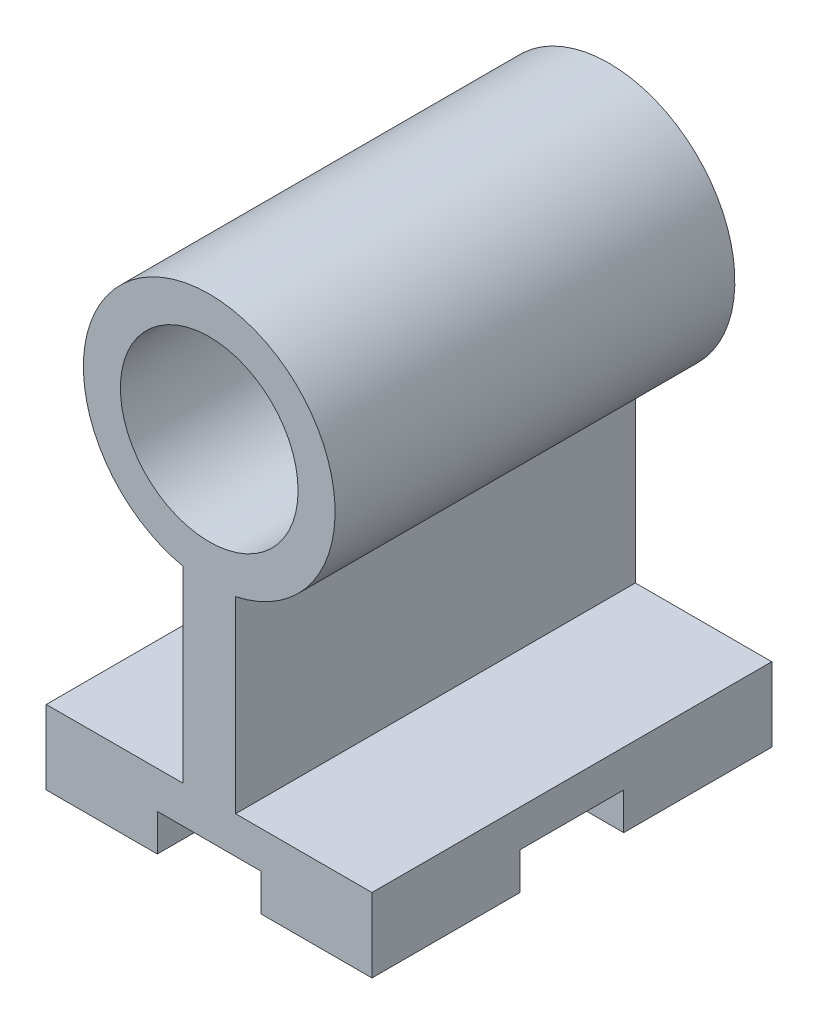
ISO-10303-21;
HEADER;
FILE_DESCRIPTION(('STEP AP214'),'2;1');
FILE_NAME('part.step','',(''),(''),'','','');
FILE_SCHEMA(('AUTOMOTIVE_DESIGN { 1 0 10303 214 1 1 1 1 }'));
ENDSEC;
DATA;
#1=APPLICATION_CONTEXT('core data for automotive mechanical design processes');
#2=APPLICATION_PROTOCOL_DEFINITION('international standard','automotive_design',2000,#1);
#3=PRODUCT_CONTEXT('',#1,'mechanical');
#4=PRODUCT('Part','Part','',(#3));
#5=PRODUCT_RELATED_PRODUCT_CATEGORY('part','',(#4));
#6=PRODUCT_DEFINITION_FORMATION('','',#4);
#7=PRODUCT_DEFINITION_CONTEXT('part definition',#1,'design');
#8=PRODUCT_DEFINITION('design','',#6,#7);
#9=PRODUCT_DEFINITION_SHAPE('','',#8);
#10=(LENGTH_UNIT() NAMED_UNIT(*) SI_UNIT(.MILLI.,.METRE.));
#11=(NAMED_UNIT(*) PLANE_ANGLE_UNIT() SI_UNIT($,.RADIAN.));
#12=(NAMED_UNIT(*) SI_UNIT($,.STERADIAN.) SOLID_ANGLE_UNIT());
#13=UNCERTAINTY_MEASURE_WITH_UNIT(LENGTH_MEASURE(1.E-05),#10,'distance_accuracy_value','');
#14=(GEOMETRIC_REPRESENTATION_CONTEXT(3) GLOBAL_UNCERTAINTY_ASSIGNED_CONTEXT((#13)) GLOBAL_UNIT_ASSIGNED_CONTEXT((#10,
#11,#12)) REPRESENTATION_CONTEXT('',''));
#15=CARTESIAN_POINT('',(0.,0.,0.));
#16=DIRECTION('',(0.,0.,1.));
#17=DIRECTION('',(1.,0.,0.));
#18=AXIS2_PLACEMENT_3D('',#15,#16,#17);
#19=CARTESIAN_POINT('',(7.,0.,-54.));
#20=DIRECTION('',(0.,-1.,0.));
#21=DIRECTION('',(1.,0.,0.));
#22=AXIS2_PLACEMENT_3D('',#19,#20,#21);
#23=PLANE('',#22);
#24=DIRECTION('',(1.,0.,0.));
#25=VECTOR('',#24,1.);
#26=CARTESIAN_POINT('',(-22.,0.,-20.));
#27=LINE('',#26,#25);
#28=CARTESIAN_POINT('',(7.,0.,-20.));
#29=VERTEX_POINT('',#28);
#30=CARTESIAN_POINT('',(22.,0.,-20.));
#31=VERTEX_POINT('',#30);
#32=EDGE_CURVE('E183',#29,#31,#27,.T.);
#33=ORIENTED_EDGE('',*,*,#32,.T.);
#34=DIRECTION('',(0.,0.,1.));
#35=VECTOR('',#34,1.);
#36=CARTESIAN_POINT('',(22.,0.,-54.));
#37=LINE('',#36,#35);
#38=CARTESIAN_POINT('',(22.,0.,0.));
#39=VERTEX_POINT('',#38);
#40=EDGE_CURVE('E221',#31,#39,#37,.T.);
#41=ORIENTED_EDGE('',*,*,#40,.T.);
#42=DIRECTION('',(1.,0.,0.));
#43=VECTOR('',#42,1.);
#44=CARTESIAN_POINT('',(7.,0.,0.));
#45=LINE('',#44,#43);
#46=CARTESIAN_POINT('',(7.,0.,0.));
#47=VERTEX_POINT('',#46);
#48=EDGE_CURVE('E239',#47,#39,#45,.T.);
#49=ORIENTED_EDGE('',*,*,#48,.F.);
#50=DIRECTION('',(0.,0.,1.));
#51=VECTOR('',#50,1.);
#52=CARTESIAN_POINT('',(7.,0.,-54.));
#53=LINE('',#52,#51);
#54=EDGE_CURVE('E42',#29,#47,#53,.T.);
#55=ORIENTED_EDGE('',*,*,#54,.F.);
#56=EDGE_LOOP('',(#33,#41,#49,#55));
#57=FACE_BOUND('',#56,.T.);
#58=ADVANCED_FACE('F33',(#57),#23,.T.);
#59=CARTESIAN_POINT('',(7.,0.,-54.));
#60=DIRECTION('',(-1.,0.,0.));
#61=DIRECTION('',(0.,0.,1.));
#62=AXIS2_PLACEMENT_3D('',#59,#60,#61);
#63=PLANE('',#62);
#64=DIRECTION('',(0.,1.,0.));
#65=VECTOR('',#64,1.);
#66=CARTESIAN_POINT('',(7.,0.,-20.));
#67=LINE('',#66,#65);
#68=CARTESIAN_POINT('',(7.,5.,-20.));
#69=VERTEX_POINT('',#68);
#70=EDGE_CURVE('E344',#29,#69,#67,.T.);
#71=ORIENTED_EDGE('',*,*,#70,.F.);
#72=ORIENTED_EDGE('',*,*,#54,.T.);
#73=DIRECTION('',(0.,-1.,0.));
#74=VECTOR('',#73,1.);
#75=CARTESIAN_POINT('',(7.,0.,0.));
#76=LINE('',#75,#74);
#77=CARTESIAN_POINT('',(7.,5.,0.));
#78=VERTEX_POINT('',#77);
#79=EDGE_CURVE('E270',#78,#47,#76,.T.);
#80=ORIENTED_EDGE('',*,*,#79,.F.);
#81=DIRECTION('',(0.,0.,1.));
#82=VECTOR('',#81,1.);
#83=CARTESIAN_POINT('',(7.,5.,-54.));
#84=LINE('',#83,#82);
#85=EDGE_CURVE('E276',#69,#78,#84,.T.);
#86=ORIENTED_EDGE('',*,*,#85,.F.);
#87=EDGE_LOOP('',(#71,#72,#80,#86));
#88=FACE_BOUND('',#87,.T.);
#89=ADVANCED_FACE('F386',(#88),#63,.T.);
#90=CARTESIAN_POINT('',(-7.,0.,-54.));
#91=DIRECTION('',(1.,0.,0.));
#92=DIRECTION('',(0.,0.,-1.));
#93=AXIS2_PLACEMENT_3D('',#90,#91,#92);
#94=PLANE('',#93);
#95=DIRECTION('',(0.,-1.,0.));
#96=VECTOR('',#95,1.);
#97=CARTESIAN_POINT('',(-7.,0.,-20.));
#98=LINE('',#97,#96);
#99=CARTESIAN_POINT('',(-7.,5.,-20.));
#100=VERTEX_POINT('',#99);
#101=CARTESIAN_POINT('',(-7.,0.,-20.));
#102=VERTEX_POINT('',#101);
#103=EDGE_CURVE('E179',#100,#102,#98,.T.);
#104=ORIENTED_EDGE('',*,*,#103,.F.);
#105=DIRECTION('',(0.,0.,1.));
#106=VECTOR('',#105,1.);
#107=CARTESIAN_POINT('',(-7.,5.,-54.));
#108=LINE('',#107,#106);
#109=CARTESIAN_POINT('',(-7.,5.,0.));
#110=VERTEX_POINT('',#109);
#111=EDGE_CURVE('E279',#100,#110,#108,.T.);
#112=ORIENTED_EDGE('',*,*,#111,.T.);
#113=DIRECTION('',(0.,1.,0.));
#114=VECTOR('',#113,1.);
#115=CARTESIAN_POINT('',(-7.,0.,0.));
#116=LINE('',#115,#114);
#117=CARTESIAN_POINT('',(-7.,0.,0.));
#118=VERTEX_POINT('',#117);
#119=EDGE_CURVE('E264',#118,#110,#116,.T.);
#120=ORIENTED_EDGE('',*,*,#119,.F.);
#121=DIRECTION('',(0.,0.,1.));
#122=VECTOR('',#121,1.);
#123=CARTESIAN_POINT('',(-7.,0.,-54.));
#124=LINE('',#123,#122);
#125=EDGE_CURVE('E202',#102,#118,#124,.T.);
#126=ORIENTED_EDGE('',*,*,#125,.F.);
#127=EDGE_LOOP('',(#104,#112,#120,#126));
#128=FACE_BOUND('',#127,.T.);
#129=ADVANCED_FACE('F291',(#128),#94,.T.);
#130=CARTESIAN_POINT('',(-22.,0.,-54.));
#131=DIRECTION('',(0.,-1.,0.));
#132=DIRECTION('',(0.,0.,-1.));
#133=AXIS2_PLACEMENT_3D('',#130,#131,#132);
#134=PLANE('',#133);
#135=CARTESIAN_POINT('',(-22.,0.,-20.));
#136=VERTEX_POINT('',#135);
#137=EDGE_CURVE('E174',#136,#102,#27,.T.);
#138=ORIENTED_EDGE('',*,*,#137,.T.);
#139=ORIENTED_EDGE('',*,*,#125,.T.);
#140=DIRECTION('',(1.,0.,0.));
#141=VECTOR('',#140,1.);
#142=CARTESIAN_POINT('',(-22.,0.,0.));
#143=LINE('',#142,#141);
#144=CARTESIAN_POINT('',(-22.,0.,0.));
#145=VERTEX_POINT('',#144);
#146=EDGE_CURVE('E196',#145,#118,#143,.T.);
#147=ORIENTED_EDGE('',*,*,#146,.F.);
#148=DIRECTION('',(0.,0.,1.));
#149=VECTOR('',#148,1.);
#150=CARTESIAN_POINT('',(-22.,0.,-54.));
#151=LINE('',#150,#149);
#152=EDGE_CURVE('E188',#136,#145,#151,.T.);
#153=ORIENTED_EDGE('',*,*,#152,.F.);
#154=EDGE_LOOP('',(#138,#139,#147,#153));
#155=FACE_BOUND('',#154,.T.);
#156=ADVANCED_FACE('F194',(#155),#134,.T.);
#157=DIRECTION('',(1.,0.,0.));
#158=VECTOR('',#157,1.);
#159=CARTESIAN_POINT('',(-22.,0.,-34.));
#160=LINE('',#159,#158);
#161=CARTESIAN_POINT('',(7.,0.,-34.));
#162=VERTEX_POINT('',#161);
#163=CARTESIAN_POINT('',(22.,0.,-34.));
#164=VERTEX_POINT('',#163);
#165=EDGE_CURVE('E58',#162,#164,#160,.T.);
#166=ORIENTED_EDGE('',*,*,#165,.F.);
#167=CARTESIAN_POINT('',(7.,0.,-54.));
#168=VERTEX_POINT('',#167);
#169=EDGE_CURVE('E11',#168,#162,#53,.T.);
#170=ORIENTED_EDGE('',*,*,#169,.F.);
#171=DIRECTION('',(1.,0.,0.));
#172=VECTOR('',#171,1.);
#173=CARTESIAN_POINT('',(7.,0.,-54.));
#174=LINE('',#173,#172);
#175=CARTESIAN_POINT('',(22.,0.,-54.));
#176=VERTEX_POINT('',#175);
#177=EDGE_CURVE('E272',#168,#176,#174,.T.);
#178=ORIENTED_EDGE('',*,*,#177,.T.);
#179=EDGE_CURVE('E37',#176,#164,#37,.T.);
#180=ORIENTED_EDGE('',*,*,#179,.T.);
#181=EDGE_LOOP('',(#166,#170,#178,#180));
#182=FACE_BOUND('',#181,.T.);
#183=ADVANCED_FACE('F35',(#182),#23,.T.);
#184=DIRECTION('',(0.,-1.,0.));
#185=VECTOR('',#184,1.);
#186=CARTESIAN_POINT('',(7.,0.,-34.));
#187=LINE('',#186,#185);
#188=CARTESIAN_POINT('',(7.,5.,-34.));
#189=VERTEX_POINT('',#188);
#190=EDGE_CURVE('E341',#189,#162,#187,.T.);
#191=ORIENTED_EDGE('',*,*,#190,.F.);
#192=CARTESIAN_POINT('',(7.,5.,-54.));
#193=VERTEX_POINT('',#192);
#194=EDGE_CURVE('E274',#193,#189,#84,.T.);
#195=ORIENTED_EDGE('',*,*,#194,.F.);
#196=DIRECTION('',(0.,-1.,0.));
#197=VECTOR('',#196,1.);
#198=CARTESIAN_POINT('',(7.,0.,-54.));
#199=LINE('',#198,#197);
#200=EDGE_CURVE('E224',#193,#168,#199,.T.);
#201=ORIENTED_EDGE('',*,*,#200,.T.);
#202=ORIENTED_EDGE('',*,*,#169,.T.);
#203=EDGE_LOOP('',(#191,#195,#201,#202));
#204=FACE_BOUND('',#203,.T.);
#205=ADVANCED_FACE('F378',(#204),#63,.T.);
#206=CARTESIAN_POINT('',(-7.,5.,-54.));
#207=DIRECTION('',(0.,-1.,0.));
#208=DIRECTION('',(1.,0.,0.));
#209=AXIS2_PLACEMENT_3D('',#206,#207,#208);
#210=PLANE('',#209);
#211=ORIENTED_EDGE('',*,*,#194,.T.);
#212=DIRECTION('',(1.,0.,0.));
#213=VECTOR('',#212,1.);
#214=CARTESIAN_POINT('',(-22.,5.,-34.));
#215=LINE('',#214,#213);
#216=CARTESIAN_POINT('',(22.,5.,-34.));
#217=VERTEX_POINT('',#216);
#218=EDGE_CURVE('E338',#189,#217,#215,.T.);
#219=ORIENTED_EDGE('',*,*,#218,.T.);
#220=DIRECTION('',(0.,0.,1.));
#221=VECTOR('',#220,1.);
#222=CARTESIAN_POINT('',(22.,5.,-20.));
#223=LINE('',#222,#221);
#224=CARTESIAN_POINT('',(22.,5.,-20.));
#225=VERTEX_POINT('',#224);
#226=EDGE_CURVE('E192',#217,#225,#223,.T.);
#227=ORIENTED_EDGE('',*,*,#226,.T.);
#228=DIRECTION('',(1.,0.,0.));
#229=VECTOR('',#228,1.);
#230=CARTESIAN_POINT('',(-22.,5.,-20.));
#231=LINE('',#230,#229);
#232=EDGE_CURVE('E335',#69,#225,#231,.T.);
#233=ORIENTED_EDGE('',*,*,#232,.F.);
#234=ORIENTED_EDGE('',*,*,#85,.T.);
#235=DIRECTION('',(1.,0.,0.));
#236=VECTOR('',#235,1.);
#237=CARTESIAN_POINT('',(-7.,5.,0.));
#238=LINE('',#237,#236);
#239=EDGE_CURVE('E267',#110,#78,#238,.T.);
#240=ORIENTED_EDGE('',*,*,#239,.F.);
#241=ORIENTED_EDGE('',*,*,#111,.F.);
#242=CARTESIAN_POINT('',(-22.,5.,-20.));
#243=VERTEX_POINT('',#242);
#244=EDGE_CURVE('E332',#243,#100,#231,.T.);
#245=ORIENTED_EDGE('',*,*,#244,.F.);
#246=DIRECTION('',(0.,0.,1.));
#247=VECTOR('',#246,1.);
#248=CARTESIAN_POINT('',(-22.,5.,-20.));
#249=LINE('',#248,#247);
#250=CARTESIAN_POINT('',(-22.,5.,-34.));
#251=VERTEX_POINT('',#250);
#252=EDGE_CURVE('E50',#251,#243,#249,.T.);
#253=ORIENTED_EDGE('',*,*,#252,.F.);
#254=CARTESIAN_POINT('',(-7.,5.,-34.));
#255=VERTEX_POINT('',#254);
#256=EDGE_CURVE('E336',#251,#255,#215,.T.);
#257=ORIENTED_EDGE('',*,*,#256,.T.);
#258=CARTESIAN_POINT('',(-7.,5.,-54.));
#259=VERTEX_POINT('',#258);
#260=EDGE_CURVE('E277',#259,#255,#108,.T.);
#261=ORIENTED_EDGE('',*,*,#260,.F.);
#262=DIRECTION('',(1.,0.,0.));
#263=VECTOR('',#262,1.);
#264=CARTESIAN_POINT('',(-7.,5.,-54.));
#265=LINE('',#264,#263);
#266=EDGE_CURVE('E230',#259,#193,#265,.T.);
#267=ORIENTED_EDGE('',*,*,#266,.T.);
#268=EDGE_LOOP('',(#211,#219,#227,#233,#234,#240,#241,#245,#253,#257,#261,#267));
#269=FACE_BOUND('',#268,.T.);
#270=ADVANCED_FACE('F379',(#269),#210,.T.);
#271=DIRECTION('',(0.,1.,0.));
#272=VECTOR('',#271,1.);
#273=CARTESIAN_POINT('',(-7.,0.,-34.));
#274=LINE('',#273,#272);
#275=CARTESIAN_POINT('',(-7.,0.,-34.));
#276=VERTEX_POINT('',#275);
#277=EDGE_CURVE('E334',#276,#255,#274,.T.);
#278=ORIENTED_EDGE('',*,*,#277,.F.);
#279=CARTESIAN_POINT('',(-7.,0.,-54.));
#280=VERTEX_POINT('',#279);
#281=EDGE_CURVE('E206',#280,#276,#124,.T.);
#282=ORIENTED_EDGE('',*,*,#281,.F.);
#283=DIRECTION('',(0.,1.,0.));
#284=VECTOR('',#283,1.);
#285=CARTESIAN_POINT('',(-7.,0.,-54.));
#286=LINE('',#285,#284);
#287=EDGE_CURVE('E235',#280,#259,#286,.T.);
#288=ORIENTED_EDGE('',*,*,#287,.T.);
#289=ORIENTED_EDGE('',*,*,#260,.T.);
#290=EDGE_LOOP('',(#278,#282,#288,#289));
#291=FACE_BOUND('',#290,.T.);
#292=ADVANCED_FACE('F318',(#291),#94,.T.);
#293=CARTESIAN_POINT('',(-22.,0.,-34.));
#294=VERTEX_POINT('',#293);
#295=EDGE_CURVE('E321',#294,#276,#160,.T.);
#296=ORIENTED_EDGE('',*,*,#295,.F.);
#297=CARTESIAN_POINT('',(-22.,0.,-54.));
#298=VERTEX_POINT('',#297);
#299=EDGE_CURVE('E198',#298,#294,#151,.T.);
#300=ORIENTED_EDGE('',*,*,#299,.F.);
#301=DIRECTION('',(1.,0.,0.));
#302=VECTOR('',#301,1.);
#303=CARTESIAN_POINT('',(-22.,0.,-54.));
#304=LINE('',#303,#302);
#305=EDGE_CURVE('E309',#298,#280,#304,.T.);
#306=ORIENTED_EDGE('',*,*,#305,.T.);
#307=ORIENTED_EDGE('',*,*,#281,.T.);
#308=EDGE_LOOP('',(#296,#300,#306,#307));
#309=FACE_BOUND('',#308,.T.);
#310=ADVANCED_FACE('F320',(#309),#134,.T.);
#311=CARTESIAN_POINT('',(-22.,0.,-54.));
#312=DIRECTION('',(-1.,0.,0.));
#313=DIRECTION('',(0.,-1.,0.));
#314=AXIS2_PLACEMENT_3D('',#311,#312,#313);
#315=PLANE('',#314);
#316=DIRECTION('',(0.,-1.,0.));
#317=VECTOR('',#316,1.);
#318=CARTESIAN_POINT('',(-22.,0.,-20.));
#319=LINE('',#318,#317);
#320=EDGE_CURVE('E177',#243,#136,#319,.T.);
#321=ORIENTED_EDGE('',*,*,#320,.T.);
#322=ORIENTED_EDGE('',*,*,#152,.T.);
#323=DIRECTION('',(0.,-1.,0.));
#324=VECTOR('',#323,1.);
#325=CARTESIAN_POINT('',(-22.,0.,0.));
#326=LINE('',#325,#324);
#327=CARTESIAN_POINT('',(-22.,10.,0.));
#328=VERTEX_POINT('',#327);
#329=EDGE_CURVE('E261',#328,#145,#326,.T.);
#330=ORIENTED_EDGE('',*,*,#329,.F.);
#331=DIRECTION('',(0.,0.,1.));
#332=VECTOR('',#331,1.);
#333=CARTESIAN_POINT('',(-22.,10.,-54.));
#334=LINE('',#333,#332);
#335=CARTESIAN_POINT('',(-22.,10.,-54.));
#336=VERTEX_POINT('',#335);
#337=EDGE_CURVE('E199',#336,#328,#334,.T.);
#338=ORIENTED_EDGE('',*,*,#337,.F.);
#339=DIRECTION('',(0.,-1.,0.));
#340=VECTOR('',#339,1.);
#341=CARTESIAN_POINT('',(-22.,0.,-54.));
#342=LINE('',#341,#340);
#343=EDGE_CURVE('E297',#336,#298,#342,.T.);
#344=ORIENTED_EDGE('',*,*,#343,.T.);
#345=ORIENTED_EDGE('',*,*,#299,.T.);
#346=DIRECTION('',(0.,1.,0.));
#347=VECTOR('',#346,1.);
#348=CARTESIAN_POINT('',(-22.,0.,-34.));
#349=LINE('',#348,#347);
#350=EDGE_CURVE('E191',#294,#251,#349,.T.);
#351=ORIENTED_EDGE('',*,*,#350,.T.);
#352=ORIENTED_EDGE('',*,*,#252,.T.);
#353=EDGE_LOOP('',(#321,#322,#330,#338,#344,#345,#351,#352));
#354=FACE_BOUND('',#353,.T.);
#355=ADVANCED_FACE('F186',(#354),#315,.T.);
#356=CARTESIAN_POINT('',(-22.,10.,-54.));
#357=DIRECTION('',(-0.00128591107310643,0.999999173216014,0.));
#358=DIRECTION('',(-0.999999173216014,-0.00128591107310643,0.));
#359=AXIS2_PLACEMENT_3D('',#356,#357,#358);
#360=PLANE('',#359);
#361=DIRECTION('',(-0.999999173216014,-0.00128591107310643,0.));
#362=VECTOR('',#361,1.);
#363=CARTESIAN_POINT('',(-22.,10.,0.));
#364=LINE('',#363,#362);
#365=CARTESIAN_POINT('',(-3.54293612880951,10.023734162432,0.));
#366=VERTEX_POINT('',#365);
#367=EDGE_CURVE('E258',#366,#328,#364,.T.);
#368=ORIENTED_EDGE('',*,*,#367,.F.);
#369=DIRECTION('',(0.,0.,1.));
#370=VECTOR('',#369,1.);
#371=CARTESIAN_POINT('',(-3.54293612880951,10.023734162432,-54.));
#372=LINE('',#371,#370);
#373=CARTESIAN_POINT('',(-3.54293612880951,10.023734162432,-54.));
#374=VERTEX_POINT('',#373);
#375=EDGE_CURVE('E203',#374,#366,#372,.T.);
#376=ORIENTED_EDGE('',*,*,#375,.F.);
#377=DIRECTION('',(-0.999999173216014,-0.00128591107310643,0.));
#378=VECTOR('',#377,1.);
#379=CARTESIAN_POINT('',(-22.,10.,-54.));
#380=LINE('',#379,#378);
#381=EDGE_CURVE('E306',#374,#336,#380,.T.);
#382=ORIENTED_EDGE('',*,*,#381,.T.);
#383=ORIENTED_EDGE('',*,*,#337,.T.);
#384=EDGE_LOOP('',(#368,#376,#382,#383));
#385=FACE_BOUND('',#384,.T.);
#386=ADVANCED_FACE('F311',(#385),#360,.T.);
#387=CARTESIAN_POINT('',(-3.54293612880951,35.4051633381654,-54.));
#388=DIRECTION('',(-1.,0.,0.));
#389=DIRECTION('',(0.,0.,1.));
#390=AXIS2_PLACEMENT_3D('',#387,#388,#389);
#391=PLANE('',#390);
#392=DIRECTION('',(0.,-1.,0.));
#393=VECTOR('',#392,1.);
#394=CARTESIAN_POINT('',(-3.54293612880951,35.4051633381654,0.));
#395=LINE('',#394,#393);
#396=CARTESIAN_POINT('',(-3.54293612880952,35.4051633381654,0.));
#397=VERTEX_POINT('',#396);
#398=EDGE_CURVE('E255',#397,#366,#395,.T.);
#399=ORIENTED_EDGE('',*,*,#398,.F.);
#400=DIRECTION('',(0.,0.,1.));
#401=VECTOR('',#400,1.);
#402=CARTESIAN_POINT('',(-3.54293612880952,35.4051633381654,-54.));
#403=LINE('',#402,#401);
#404=CARTESIAN_POINT('',(-3.54293612880952,35.4051633381654,-54.));
#405=VERTEX_POINT('',#404);
#406=EDGE_CURVE('E210',#405,#397,#403,.T.);
#407=ORIENTED_EDGE('',*,*,#406,.F.);
#408=DIRECTION('',(0.,-1.,0.));
#409=VECTOR('',#408,1.);
#410=CARTESIAN_POINT('',(-3.54293612880951,35.4051633381654,-54.));
#411=LINE('',#410,#409);
#412=EDGE_CURVE('E312',#405,#374,#411,.T.);
#413=ORIENTED_EDGE('',*,*,#412,.T.);
#414=ORIENTED_EDGE('',*,*,#375,.T.);
#415=EDGE_LOOP('',(#399,#407,#413,#414));
#416=FACE_BOUND('',#415,.T.);
#417=ADVANCED_FACE('F428',(#416),#391,.T.);
#418=CARTESIAN_POINT('',(0.0165296468139821,52.0283460476277,-54.));
#419=DIRECTION('',(0.,0.,1.));
#420=DIRECTION('',(1.,0.,0.));
#421=AXIS2_PLACEMENT_3D('',#418,#419,#420);
#422=CYLINDRICAL_SURFACE('',#421,17.);
#423=CARTESIAN_POINT('',(0.0165296468139821,52.0283460476277,0.));
#424=DIRECTION('',(0.,0.,1.));
#425=DIRECTION('',(1.,0.,0.));
#426=AXIS2_PLACEMENT_3D('',#423,#424,#425);
#427=CIRCLE('',#426,17.);
#428=CARTESIAN_POINT('',(3.57599542243748,35.4051633381654,0.));
#429=VERTEX_POINT('',#428);
#430=EDGE_CURVE('E252',#429,#397,#427,.T.);
#431=ORIENTED_EDGE('',*,*,#430,.F.);
#432=DIRECTION('',(0.,0.,1.));
#433=VECTOR('',#432,1.);
#434=CARTESIAN_POINT('',(3.57599542243748,35.4051633381654,-54.));
#435=LINE('',#434,#433);
#436=CARTESIAN_POINT('',(3.57599542243748,35.4051633381654,-54.));
#437=VERTEX_POINT('',#436);
#438=EDGE_CURVE('E212',#437,#429,#435,.T.);
#439=ORIENTED_EDGE('',*,*,#438,.F.);
#440=CARTESIAN_POINT('',(0.0165296468139821,52.0283460476277,-54.));
#441=DIRECTION('',(0.,0.,1.));
#442=DIRECTION('',(1.,0.,0.));
#443=AXIS2_PLACEMENT_3D('',#440,#441,#442);
#444=CIRCLE('',#443,17.);
#445=EDGE_CURVE('E314',#437,#405,#444,.T.);
#446=ORIENTED_EDGE('',*,*,#445,.T.);
#447=ORIENTED_EDGE('',*,*,#406,.T.);
#448=EDGE_LOOP('',(#431,#439,#446,#447));
#449=FACE_BOUND('',#448,.T.);
#450=ADVANCED_FACE('F363',(#449),#422,.T.);
#451=CARTESIAN_POINT('',(3.57599542243748,35.4051633381654,-54.));
#452=DIRECTION('',(1.,0.,0.));
#453=DIRECTION('',(0.,1.,0.));
#454=AXIS2_PLACEMENT_3D('',#451,#452,#453);
#455=PLANE('',#454);
#456=DIRECTION('',(0.,1.,0.));
#457=VECTOR('',#456,1.);
#458=CARTESIAN_POINT('',(3.57599542243748,35.4051633381654,0.));
#459=LINE('',#458,#457);
#460=CARTESIAN_POINT('',(3.57599542243748,9.99999999999999,0.));
#461=VERTEX_POINT('',#460);
#462=EDGE_CURVE('E249',#461,#429,#459,.T.);
#463=ORIENTED_EDGE('',*,*,#462,.F.);
#464=DIRECTION('',(0.,0.,1.));
#465=VECTOR('',#464,1.);
#466=CARTESIAN_POINT('',(3.57599542243748,9.99999999999999,-54.));
#467=LINE('',#466,#465);
#468=CARTESIAN_POINT('',(3.57599542243748,9.99999999999999,-54.));
#469=VERTEX_POINT('',#468);
#470=EDGE_CURVE('E214',#469,#461,#467,.T.);
#471=ORIENTED_EDGE('',*,*,#470,.F.);
#472=DIRECTION('',(0.,1.,0.));
#473=VECTOR('',#472,1.);
#474=CARTESIAN_POINT('',(3.57599542243748,35.4051633381654,-54.));
#475=LINE('',#474,#473);
#476=EDGE_CURVE('E357',#469,#437,#475,.T.);
#477=ORIENTED_EDGE('',*,*,#476,.T.);
#478=ORIENTED_EDGE('',*,*,#438,.T.);
#479=EDGE_LOOP('',(#463,#471,#477,#478));
#480=FACE_BOUND('',#479,.T.);
#481=ADVANCED_FACE('F369',(#480),#455,.T.);
#482=CARTESIAN_POINT('',(3.57599542243748,9.99999999999999,-54.));
#483=DIRECTION('',(0.,1.,0.));
#484=DIRECTION('',(-1.,0.,0.));
#485=AXIS2_PLACEMENT_3D('',#482,#483,#484);
#486=PLANE('',#485);
#487=DIRECTION('',(-1.,0.,0.));
#488=VECTOR('',#487,1.);
#489=CARTESIAN_POINT('',(3.57599542243748,9.99999999999999,0.));
#490=LINE('',#489,#488);
#491=CARTESIAN_POINT('',(22.,10.,0.));
#492=VERTEX_POINT('',#491);
#493=EDGE_CURVE('E246',#492,#461,#490,.T.);
#494=ORIENTED_EDGE('',*,*,#493,.F.);
#495=DIRECTION('',(0.,0.,1.));
#496=VECTOR('',#495,1.);
#497=CARTESIAN_POINT('',(22.,10.,-54.));
#498=LINE('',#497,#496);
#499=CARTESIAN_POINT('',(22.,10.,-54.));
#500=VERTEX_POINT('',#499);
#501=EDGE_CURVE('E215',#500,#492,#498,.T.);
#502=ORIENTED_EDGE('',*,*,#501,.F.);
#503=DIRECTION('',(-1.,0.,0.));
#504=VECTOR('',#503,1.);
#505=CARTESIAN_POINT('',(3.57599542243748,9.99999999999999,-54.));
#506=LINE('',#505,#504);
#507=EDGE_CURVE('E354',#500,#469,#506,.T.);
#508=ORIENTED_EDGE('',*,*,#507,.T.);
#509=ORIENTED_EDGE('',*,*,#470,.T.);
#510=EDGE_LOOP('',(#494,#502,#508,#509));
#511=FACE_BOUND('',#510,.T.);
#512=ADVANCED_FACE('F371',(#511),#486,.T.);
#513=CARTESIAN_POINT('',(22.,0.,-54.));
#514=DIRECTION('',(1.,0.,0.));
#515=DIRECTION('',(0.,0.,-1.));
#516=AXIS2_PLACEMENT_3D('',#513,#514,#515);
#517=PLANE('',#516);
#518=DIRECTION('',(0.,-1.,0.));
#519=VECTOR('',#518,1.);
#520=CARTESIAN_POINT('',(22.,0.,-20.));
#521=LINE('',#520,#519);
#522=EDGE_CURVE('E326',#225,#31,#521,.T.);
#523=ORIENTED_EDGE('',*,*,#522,.F.);
#524=ORIENTED_EDGE('',*,*,#226,.F.);
#525=DIRECTION('',(0.,1.,0.));
#526=VECTOR('',#525,1.);
#527=CARTESIAN_POINT('',(22.,0.,-34.));
#528=LINE('',#527,#526);
#529=EDGE_CURVE('E328',#164,#217,#528,.T.);
#530=ORIENTED_EDGE('',*,*,#529,.F.);
#531=ORIENTED_EDGE('',*,*,#179,.F.);
#532=DIRECTION('',(0.,1.,0.));
#533=VECTOR('',#532,1.);
#534=CARTESIAN_POINT('',(22.,0.,-54.));
#535=LINE('',#534,#533);
#536=EDGE_CURVE('E352',#176,#500,#535,.T.);
#537=ORIENTED_EDGE('',*,*,#536,.T.);
#538=ORIENTED_EDGE('',*,*,#501,.T.);
#539=DIRECTION('',(0.,1.,0.));
#540=VECTOR('',#539,1.);
#541=CARTESIAN_POINT('',(22.,0.,0.));
#542=LINE('',#541,#540);
#543=EDGE_CURVE('E242',#39,#492,#542,.T.);
#544=ORIENTED_EDGE('',*,*,#543,.F.);
#545=ORIENTED_EDGE('',*,*,#40,.F.);
#546=EDGE_LOOP('',(#523,#524,#530,#531,#537,#538,#544,#545));
#547=FACE_BOUND('',#546,.T.);
#548=ADVANCED_FACE('F374',(#547),#517,.T.);
#549=CARTESIAN_POINT('',(0.0165296468139821,52.0283460476277,-54.));
#550=DIRECTION('',(0.,0.,1.));
#551=DIRECTION('',(1.,0.,0.));
#552=AXIS2_PLACEMENT_3D('',#549,#550,#551);
#553=PLANE('',#552);
#554=CARTESIAN_POINT('',(0.0165296468139821,52.0283460476277,-54.));
#555=DIRECTION('',(0.,0.,1.));
#556=DIRECTION('',(1.,0.,0.));
#557=AXIS2_PLACEMENT_3D('',#554,#555,#556);
#558=CIRCLE('',#557,12.);
#559=CARTESIAN_POINT('',(12.016529646814,52.0283460476277,-54.));
#560=VERTEX_POINT('',#559);
#561=EDGE_CURVE('E243',#560,#560,#558,.T.);
#562=ORIENTED_EDGE('',*,*,#561,.T.);
#563=EDGE_LOOP('',(#562));
#564=FACE_BOUND('',#563,.T.);
#565=ORIENTED_EDGE('',*,*,#177,.F.);
#566=ORIENTED_EDGE('',*,*,#200,.F.);
#567=ORIENTED_EDGE('',*,*,#266,.F.);
#568=ORIENTED_EDGE('',*,*,#287,.F.);
#569=ORIENTED_EDGE('',*,*,#305,.F.);
#570=ORIENTED_EDGE('',*,*,#343,.F.);
#571=ORIENTED_EDGE('',*,*,#381,.F.);
#572=ORIENTED_EDGE('',*,*,#412,.F.);
#573=ORIENTED_EDGE('',*,*,#445,.F.);
#574=ORIENTED_EDGE('',*,*,#476,.F.);
#575=ORIENTED_EDGE('',*,*,#507,.F.);
#576=ORIENTED_EDGE('',*,*,#536,.F.);
#577=EDGE_LOOP('',(#565,#566,#567,#568,#569,#570,#571,#572,#573,#574,#575,#576));
#578=FACE_BOUND('',#577,.T.);
#579=ADVANCED_FACE('F304',(#564,#578),#553,.F.);
#580=CARTESIAN_POINT('',(0.0165296468139821,52.0283460476277,0.));
#581=DIRECTION('',(0.,0.,1.));
#582=DIRECTION('',(1.,0.,0.));
#583=AXIS2_PLACEMENT_3D('',#580,#581,#582);
#584=PLANE('',#583);
#585=CARTESIAN_POINT('',(0.0165296468139821,52.0283460476277,0.));
#586=DIRECTION('',(0.,0.,1.));
#587=DIRECTION('',(1.,0.,0.));
#588=AXIS2_PLACEMENT_3D('',#585,#586,#587);
#589=CIRCLE('',#588,12.);
#590=CARTESIAN_POINT('',(12.016529646814,52.0283460476277,0.));
#591=VERTEX_POINT('',#590);
#592=EDGE_CURVE('E346',#591,#591,#589,.T.);
#593=ORIENTED_EDGE('',*,*,#592,.F.);
#594=EDGE_LOOP('',(#593));
#595=FACE_BOUND('',#594,.T.);
#596=ORIENTED_EDGE('',*,*,#48,.T.);
#597=ORIENTED_EDGE('',*,*,#543,.T.);
#598=ORIENTED_EDGE('',*,*,#493,.T.);
#599=ORIENTED_EDGE('',*,*,#462,.T.);
#600=ORIENTED_EDGE('',*,*,#430,.T.);
#601=ORIENTED_EDGE('',*,*,#398,.T.);
#602=ORIENTED_EDGE('',*,*,#367,.T.);
#603=ORIENTED_EDGE('',*,*,#329,.T.);
#604=ORIENTED_EDGE('',*,*,#146,.T.);
#605=ORIENTED_EDGE('',*,*,#119,.T.);
#606=ORIENTED_EDGE('',*,*,#239,.T.);
#607=ORIENTED_EDGE('',*,*,#79,.T.);
#608=EDGE_LOOP('',(#596,#597,#598,#599,#600,#601,#602,#603,#604,#605,#606,#607));
#609=FACE_BOUND('',#608,.T.);
#610=ADVANCED_FACE('F293',(#595,#609),#584,.T.);
#611=CARTESIAN_POINT('',(0.0165296468139821,52.0283460476277,-54.));
#612=DIRECTION('',(0.,0.,1.));
#613=DIRECTION('',(1.,0.,0.));
#614=AXIS2_PLACEMENT_3D('',#611,#612,#613);
#615=CYLINDRICAL_SURFACE('',#614,12.);
#616=ORIENTED_EDGE('',*,*,#561,.F.);
#617=EDGE_LOOP('',(#616));
#618=FACE_BOUND('',#617,.T.);
#619=ORIENTED_EDGE('',*,*,#592,.T.);
#620=EDGE_LOOP('',(#619));
#621=FACE_BOUND('',#620,.T.);
#622=ADVANCED_FACE('F407',(#618,#621),#615,.F.);
#623=CARTESIAN_POINT('',(-22.,0.,-34.));
#624=DIRECTION('',(0.,0.,-1.));
#625=DIRECTION('',(-1.,0.,0.));
#626=AXIS2_PLACEMENT_3D('',#623,#624,#625);
#627=PLANE('',#626);
#628=ORIENTED_EDGE('',*,*,#190,.T.);
#629=ORIENTED_EDGE('',*,*,#165,.T.);
#630=ORIENTED_EDGE('',*,*,#529,.T.);
#631=ORIENTED_EDGE('',*,*,#218,.F.);
#632=EDGE_LOOP('',(#628,#629,#630,#631));
#633=FACE_BOUND('',#632,.T.);
#634=ADVANCED_FACE('F376',(#633),#627,.F.);
#635=CARTESIAN_POINT('',(-22.,0.,-20.));
#636=DIRECTION('',(0.,0.,1.));
#637=DIRECTION('',(1.,0.,0.));
#638=AXIS2_PLACEMENT_3D('',#635,#636,#637);
#639=PLANE('',#638);
#640=ORIENTED_EDGE('',*,*,#70,.T.);
#641=ORIENTED_EDGE('',*,*,#232,.T.);
#642=ORIENTED_EDGE('',*,*,#522,.T.);
#643=ORIENTED_EDGE('',*,*,#32,.F.);
#644=EDGE_LOOP('',(#640,#641,#642,#643));
#645=FACE_BOUND('',#644,.T.);
#646=ADVANCED_FACE('F399',(#645),#639,.F.);
#647=ORIENTED_EDGE('',*,*,#103,.T.);
#648=ORIENTED_EDGE('',*,*,#137,.F.);
#649=ORIENTED_EDGE('',*,*,#320,.F.);
#650=ORIENTED_EDGE('',*,*,#244,.T.);
#651=EDGE_LOOP('',(#647,#648,#649,#650));
#652=FACE_BOUND('',#651,.T.);
#653=ADVANCED_FACE('F176',(#652),#639,.F.);
#654=ORIENTED_EDGE('',*,*,#277,.T.);
#655=ORIENTED_EDGE('',*,*,#256,.F.);
#656=ORIENTED_EDGE('',*,*,#350,.F.);
#657=ORIENTED_EDGE('',*,*,#295,.T.);
#658=EDGE_LOOP('',(#654,#655,#656,#657));
#659=FACE_BOUND('',#658,.T.);
#660=ADVANCED_FACE('F406',(#659),#627,.F.);
#661=CLOSED_SHELL('',(#58,#89,#129,#156,#183,#205,#270,#292,#310,#355,#386,#417,#450,#481,#512,
#548,#579,#610,#622,#634,#646,#653,#660));
#662=MANIFOLD_SOLID_BREP('B2',#661);
#663=ADVANCED_BREP_SHAPE_REPRESENTATION('',(#18,#662),#14);
#664=SHAPE_DEFINITION_REPRESENTATION(#9,#663);
ENDSEC;
END-ISO-10303-21;
